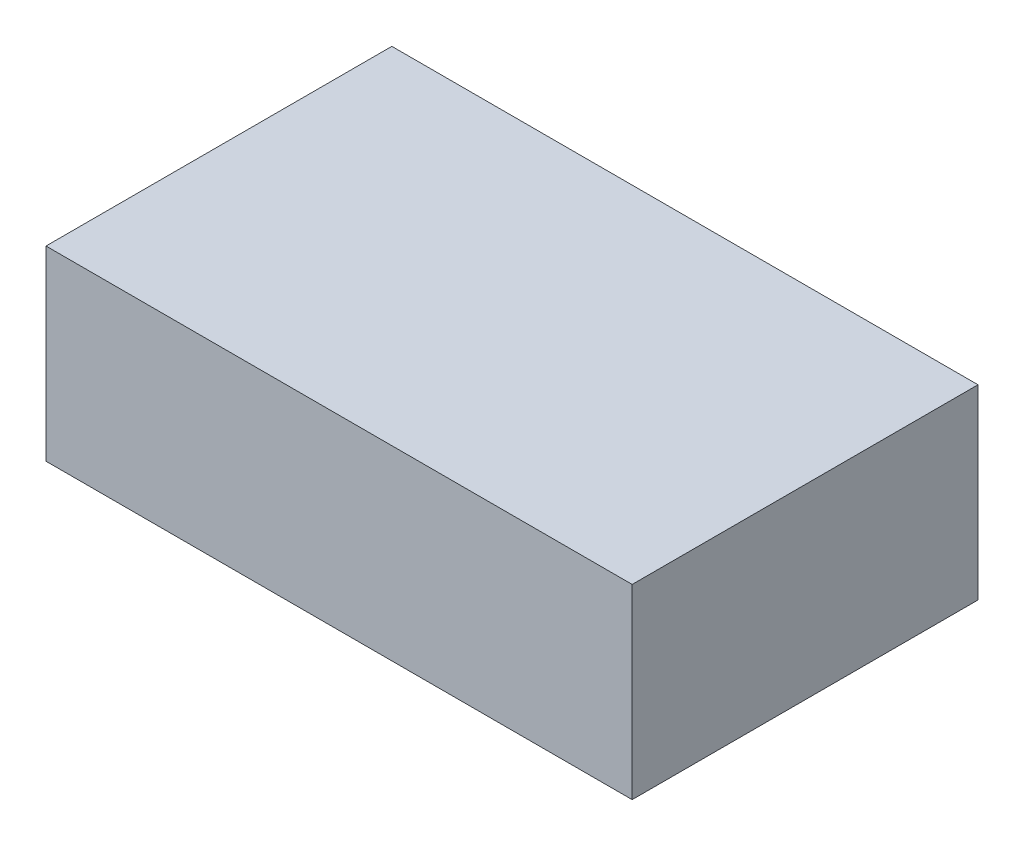
ISO-10303-21;
HEADER;
FILE_DESCRIPTION(('STEP AP214'),'2;1');
FILE_NAME('part.step','',(''),(''),'','','');
FILE_SCHEMA(('AUTOMOTIVE_DESIGN { 1 0 10303 214 1 1 1 1 }'));
ENDSEC;
DATA;
#1=APPLICATION_CONTEXT('core data for automotive mechanical design processes');
#2=APPLICATION_PROTOCOL_DEFINITION('international standard','automotive_design',2000,#1);
#3=PRODUCT_CONTEXT('',#1,'mechanical');
#4=PRODUCT('Part','Part','',(#3));
#5=PRODUCT_RELATED_PRODUCT_CATEGORY('part','',(#4));
#6=PRODUCT_DEFINITION_FORMATION('','',#4);
#7=PRODUCT_DEFINITION_CONTEXT('part definition',#1,'design');
#8=PRODUCT_DEFINITION('design','',#6,#7);
#9=PRODUCT_DEFINITION_SHAPE('','',#8);
#10=(LENGTH_UNIT() NAMED_UNIT(*) SI_UNIT(.MILLI.,.METRE.));
#11=(NAMED_UNIT(*) PLANE_ANGLE_UNIT() SI_UNIT($,.RADIAN.));
#12=(NAMED_UNIT(*) SI_UNIT($,.STERADIAN.) SOLID_ANGLE_UNIT());
#13=UNCERTAINTY_MEASURE_WITH_UNIT(LENGTH_MEASURE(1.E-05),#10,'distance_accuracy_value','');
#14=(GEOMETRIC_REPRESENTATION_CONTEXT(3) GLOBAL_UNCERTAINTY_ASSIGNED_CONTEXT((#13)) GLOBAL_UNIT_ASSIGNED_CONTEXT((#10,
#11,#12)) REPRESENTATION_CONTEXT('',''));
#15=CARTESIAN_POINT('',(0.,0.,0.));
#16=DIRECTION('',(0.,0.,1.));
#17=DIRECTION('',(1.,0.,0.));
#18=AXIS2_PLACEMENT_3D('',#15,#16,#17);
#19=CARTESIAN_POINT('',(0.,3.18,0.));
#20=DIRECTION('',(1.,0.,0.));
#21=DIRECTION('',(0.,0.,-1.));
#22=AXIS2_PLACEMENT_3D('',#19,#20,#21);
#23=PLANE('',#22);
#24=DIRECTION('',(0.,0.,1.));
#25=VECTOR('',#24,1.);
#26=CARTESIAN_POINT('',(0.,0.,0.));
#27=LINE('',#26,#25);
#28=CARTESIAN_POINT('',(0.,0.,0.));
#29=VERTEX_POINT('',#28);
#30=CARTESIAN_POINT('',(0.,0.,5.9));
#31=VERTEX_POINT('',#30);
#32=EDGE_CURVE('E96',#29,#31,#27,.T.);
#33=ORIENTED_EDGE('',*,*,#32,.T.);
#34=DIRECTION('',(0.,-1.,0.));
#35=VECTOR('',#34,1.);
#36=CARTESIAN_POINT('',(0.,3.18,5.9));
#37=LINE('',#36,#35);
#38=CARTESIAN_POINT('',(0.,3.18,5.9));
#39=VERTEX_POINT('',#38);
#40=EDGE_CURVE('E11',#39,#31,#37,.T.);
#41=ORIENTED_EDGE('',*,*,#40,.F.);
#42=DIRECTION('',(0.,0.,1.));
#43=VECTOR('',#42,1.);
#44=CARTESIAN_POINT('',(0.,3.18,0.));
#45=LINE('',#44,#43);
#46=CARTESIAN_POINT('',(0.,3.18,0.));
#47=VERTEX_POINT('',#46);
#48=EDGE_CURVE('E84',#47,#39,#45,.T.);
#49=ORIENTED_EDGE('',*,*,#48,.F.);
#50=DIRECTION('',(0.,-1.,0.));
#51=VECTOR('',#50,1.);
#52=CARTESIAN_POINT('',(0.,3.18,0.));
#53=LINE('',#52,#51);
#54=EDGE_CURVE('E92',#47,#29,#53,.T.);
#55=ORIENTED_EDGE('',*,*,#54,.T.);
#56=EDGE_LOOP('',(#33,#41,#49,#55));
#57=FACE_BOUND('',#56,.T.);
#58=ADVANCED_FACE('F33',(#57),#23,.F.);
#59=CARTESIAN_POINT('',(0.,3.18,5.9));
#60=DIRECTION('',(0.,0.,-1.));
#61=DIRECTION('',(-1.,0.,0.));
#62=AXIS2_PLACEMENT_3D('',#59,#60,#61);
#63=PLANE('',#62);
#64=DIRECTION('',(1.,0.,0.));
#65=VECTOR('',#64,1.);
#66=CARTESIAN_POINT('',(0.,0.,5.9));
#67=LINE('',#66,#65);
#68=CARTESIAN_POINT('',(10.,0.,5.9));
#69=VERTEX_POINT('',#68);
#70=EDGE_CURVE('E88',#31,#69,#67,.T.);
#71=ORIENTED_EDGE('',*,*,#70,.T.);
#72=DIRECTION('',(0.,-1.,0.));
#73=VECTOR('',#72,1.);
#74=CARTESIAN_POINT('',(10.,3.18,5.9));
#75=LINE('',#74,#73);
#76=CARTESIAN_POINT('',(10.,3.18,5.9));
#77=VERTEX_POINT('',#76);
#78=EDGE_CURVE('E41',#77,#69,#75,.T.);
#79=ORIENTED_EDGE('',*,*,#78,.F.);
#80=DIRECTION('',(1.,0.,0.));
#81=VECTOR('',#80,1.);
#82=CARTESIAN_POINT('',(0.,3.18,5.9));
#83=LINE('',#82,#81);
#84=EDGE_CURVE('E79',#39,#77,#83,.T.);
#85=ORIENTED_EDGE('',*,*,#84,.F.);
#86=ORIENTED_EDGE('',*,*,#40,.T.);
#87=EDGE_LOOP('',(#71,#79,#85,#86));
#88=FACE_BOUND('',#87,.T.);
#89=ADVANCED_FACE('F87',(#88),#63,.F.);
#90=CARTESIAN_POINT('',(10.,3.18,0.));
#91=DIRECTION('',(-1.,0.,0.));
#92=DIRECTION('',(0.,0.,1.));
#93=AXIS2_PLACEMENT_3D('',#90,#91,#92);
#94=PLANE('',#93);
#95=DIRECTION('',(0.,0.,-1.));
#96=VECTOR('',#95,1.);
#97=CARTESIAN_POINT('',(10.,0.,0.));
#98=LINE('',#97,#96);
#99=CARTESIAN_POINT('',(10.,0.,0.));
#100=VERTEX_POINT('',#99);
#101=EDGE_CURVE('E66',#69,#100,#98,.T.);
#102=ORIENTED_EDGE('',*,*,#101,.T.);
#103=DIRECTION('',(0.,-1.,0.));
#104=VECTOR('',#103,1.);
#105=CARTESIAN_POINT('',(10.,3.18,0.));
#106=LINE('',#105,#104);
#107=CARTESIAN_POINT('',(10.,3.18,0.));
#108=VERTEX_POINT('',#107);
#109=EDGE_CURVE('E89',#108,#100,#106,.T.);
#110=ORIENTED_EDGE('',*,*,#109,.F.);
#111=DIRECTION('',(0.,0.,-1.));
#112=VECTOR('',#111,1.);
#113=CARTESIAN_POINT('',(10.,3.18,0.));
#114=LINE('',#113,#112);
#115=EDGE_CURVE('E82',#77,#108,#114,.T.);
#116=ORIENTED_EDGE('',*,*,#115,.F.);
#117=ORIENTED_EDGE('',*,*,#78,.T.);
#118=EDGE_LOOP('',(#102,#110,#116,#117));
#119=FACE_BOUND('',#118,.T.);
#120=ADVANCED_FACE('F90',(#119),#94,.F.);
#121=CARTESIAN_POINT('',(0.,3.18,0.));
#122=DIRECTION('',(0.,0.,1.));
#123=DIRECTION('',(1.,0.,0.));
#124=AXIS2_PLACEMENT_3D('',#121,#122,#123);
#125=PLANE('',#124);
#126=DIRECTION('',(-1.,0.,0.));
#127=VECTOR('',#126,1.);
#128=CARTESIAN_POINT('',(0.,0.,0.));
#129=LINE('',#128,#127);
#130=EDGE_CURVE('E72',#100,#29,#129,.T.);
#131=ORIENTED_EDGE('',*,*,#130,.T.);
#132=ORIENTED_EDGE('',*,*,#54,.F.);
#133=DIRECTION('',(-1.,0.,0.));
#134=VECTOR('',#133,1.);
#135=CARTESIAN_POINT('',(0.,3.18,0.));
#136=LINE('',#135,#134);
#137=EDGE_CURVE('E49',#108,#47,#136,.T.);
#138=ORIENTED_EDGE('',*,*,#137,.F.);
#139=ORIENTED_EDGE('',*,*,#109,.T.);
#140=EDGE_LOOP('',(#131,#132,#138,#139));
#141=FACE_BOUND('',#140,.T.);
#142=ADVANCED_FACE('F103',(#141),#125,.F.);
#143=CARTESIAN_POINT('',(0.,3.18,0.));
#144=DIRECTION('',(0.,1.,0.));
#145=DIRECTION('',(0.,0.,1.));
#146=AXIS2_PLACEMENT_3D('',#143,#144,#145);
#147=PLANE('',#146);
#148=ORIENTED_EDGE('',*,*,#48,.T.);
#149=ORIENTED_EDGE('',*,*,#84,.T.);
#150=ORIENTED_EDGE('',*,*,#115,.T.);
#151=ORIENTED_EDGE('',*,*,#137,.T.);
#152=EDGE_LOOP('',(#148,#149,#150,#151));
#153=FACE_BOUND('',#152,.T.);
#154=ADVANCED_FACE('F80',(#153),#147,.T.);
#155=CARTESIAN_POINT('',(0.,0.,0.));
#156=DIRECTION('',(0.,1.,0.));
#157=DIRECTION('',(0.,0.,1.));
#158=AXIS2_PLACEMENT_3D('',#155,#156,#157);
#159=PLANE('',#158);
#160=ORIENTED_EDGE('',*,*,#32,.F.);
#161=ORIENTED_EDGE('',*,*,#130,.F.);
#162=ORIENTED_EDGE('',*,*,#101,.F.);
#163=ORIENTED_EDGE('',*,*,#70,.F.);
#164=EDGE_LOOP('',(#160,#161,#162,#163));
#165=FACE_BOUND('',#164,.T.);
#166=ADVANCED_FACE('F106',(#165),#159,.F.);
#167=CLOSED_SHELL('',(#58,#89,#120,#142,#154,#166));
#168=MANIFOLD_SOLID_BREP('B2',#167);
#169=ADVANCED_BREP_SHAPE_REPRESENTATION('',(#18,#168),#14);
#170=SHAPE_DEFINITION_REPRESENTATION(#9,#169);
ENDSEC;
END-ISO-10303-21;
